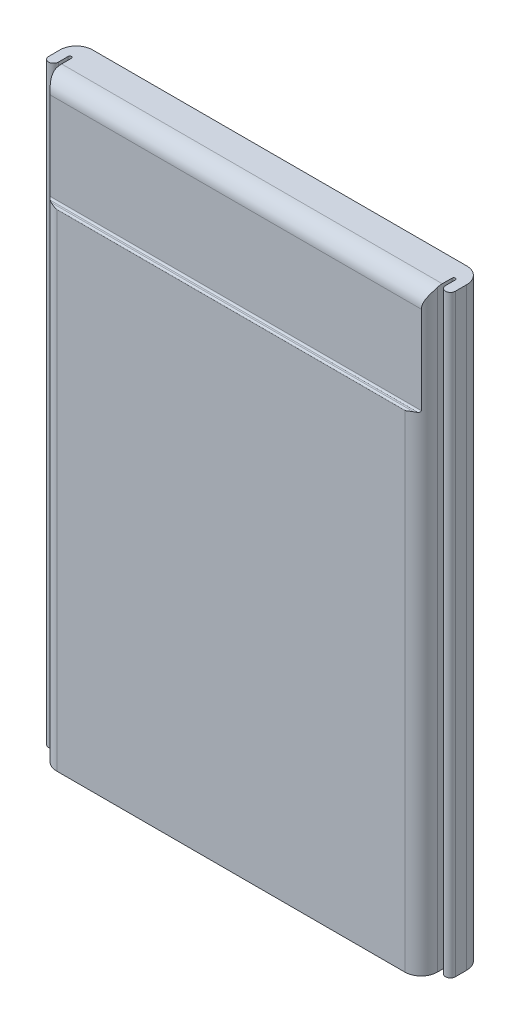
ISO-10303-21;
HEADER;
FILE_DESCRIPTION(('STEP AP214'),'2;1');
FILE_NAME('part.step','',(''),(''),'','','');
FILE_SCHEMA(('AUTOMOTIVE_DESIGN { 1 0 10303 214 1 1 1 1 }'));
ENDSEC;
DATA;
#1=APPLICATION_CONTEXT('core data for automotive mechanical design processes');
#2=APPLICATION_PROTOCOL_DEFINITION('international standard','automotive_design',2000,#1);
#3=PRODUCT_CONTEXT('',#1,'mechanical');
#4=PRODUCT('Part','Part','',(#3));
#5=PRODUCT_RELATED_PRODUCT_CATEGORY('part','',(#4));
#6=PRODUCT_DEFINITION_FORMATION('','',#4);
#7=PRODUCT_DEFINITION_CONTEXT('part definition',#1,'design');
#8=PRODUCT_DEFINITION('design','',#6,#7);
#9=PRODUCT_DEFINITION_SHAPE('','',#8);
#10=(LENGTH_UNIT() NAMED_UNIT(*) SI_UNIT(.MILLI.,.METRE.));
#11=(NAMED_UNIT(*) PLANE_ANGLE_UNIT() SI_UNIT($,.RADIAN.));
#12=(NAMED_UNIT(*) SI_UNIT($,.STERADIAN.) SOLID_ANGLE_UNIT());
#13=UNCERTAINTY_MEASURE_WITH_UNIT(LENGTH_MEASURE(1.E-05),#10,'distance_accuracy_value','');
#14=(GEOMETRIC_REPRESENTATION_CONTEXT(3) GLOBAL_UNCERTAINTY_ASSIGNED_CONTEXT((#13)) GLOBAL_UNIT_ASSIGNED_CONTEXT((#10,
#11,#12)) REPRESENTATION_CONTEXT('',''));
#15=CARTESIAN_POINT('',(0.,0.,0.));
#16=DIRECTION('',(0.,0.,1.));
#17=DIRECTION('',(1.,0.,0.));
#18=AXIS2_PLACEMENT_3D('',#15,#16,#17);
#19=CARTESIAN_POINT('',(-11.7,18.25,2.));
#20=DIRECTION('',(1.,0.,0.));
#21=DIRECTION('',(0.,0.,-1.));
#22=AXIS2_PLACEMENT_3D('',#19,#20,#21);
#23=PLANE('',#22);
#24=CARTESIAN_POINT('',(-11.7,17.25,1.7));
#25=DIRECTION('',(1.,0.,0.));
#26=DIRECTION('',(0.,0.,-1.));
#27=AXIS2_PLACEMENT_3D('',#24,#25,#26);
#28=CIRCLE('',#27,1.);
#29=CARTESIAN_POINT('',(-11.7,18.25,1.7));
#30=VERTEX_POINT('',#29);
#31=CARTESIAN_POINT('',(-11.7,18.2039392014169,2.));
#32=VERTEX_POINT('',#31);
#33=EDGE_CURVE('E354',#30,#32,#28,.T.);
#34=ORIENTED_EDGE('',*,*,#33,.F.);
#35=DIRECTION('',(0.,0.,1.));
#36=VECTOR('',#35,1.);
#37=CARTESIAN_POINT('',(-11.7,18.25,2.));
#38=LINE('',#37,#36);
#39=CARTESIAN_POINT('',(-11.7,18.25,1.1));
#40=VERTEX_POINT('',#39);
#41=EDGE_CURVE('E268',#40,#30,#38,.T.);
#42=ORIENTED_EDGE('',*,*,#41,.F.);
#43=DIRECTION('',(0.,-1.,0.));
#44=VECTOR('',#43,1.);
#45=CARTESIAN_POINT('',(-11.7,18.25,1.1));
#46=LINE('',#45,#44);
#47=CARTESIAN_POINT('',(-11.7,-18.25,1.1));
#48=VERTEX_POINT('',#47);
#49=EDGE_CURVE('E236',#40,#48,#46,.T.);
#50=ORIENTED_EDGE('',*,*,#49,.T.);
#51=DIRECTION('',(0.,0.,1.));
#52=VECTOR('',#51,1.);
#53=CARTESIAN_POINT('',(-11.7,-18.25,2.));
#54=LINE('',#53,#52);
#55=CARTESIAN_POINT('',(-11.7,-18.25,2.));
#56=VERTEX_POINT('',#55);
#57=EDGE_CURVE('E191',#48,#56,#54,.T.);
#58=ORIENTED_EDGE('',*,*,#57,.T.);
#59=DIRECTION('',(0.,-1.,0.));
#60=VECTOR('',#59,1.);
#61=CARTESIAN_POINT('',(-11.7,18.25,2.));
#62=LINE('',#61,#60);
#63=EDGE_CURVE('E234',#32,#56,#62,.T.);
#64=ORIENTED_EDGE('',*,*,#63,.F.);
#65=EDGE_LOOP('',(#34,#42,#50,#58,#64));
#66=FACE_BOUND('',#65,.T.);
#67=ADVANCED_FACE('F35',(#66),#23,.F.);
#68=CARTESIAN_POINT('',(-10.7,18.25,2.));
#69=DIRECTION('',(0.,-1.,0.));
#70=DIRECTION('',(0.,0.,-1.));
#71=AXIS2_PLACEMENT_3D('',#68,#69,#70);
#72=CYLINDRICAL_SURFACE('',#71,0.999999999999998);
#73=CARTESIAN_POINT('',(-11.1358898943541,11.75,2.9));
#74=CARTESIAN_POINT('',(-11.1214198627251,11.7499808757313,2.90701007655206));
#75=CARTESIAN_POINT('',(-11.1068006352162,11.749265460495,2.91365781850025));
#76=CARTESIAN_POINT('',(-11.0773690839468,11.7467226206552,2.9262002892041));
#77=CARTESIAN_POINT('',(-11.0625572084247,11.7448974387364,2.93209650769148));
#78=CARTESIAN_POINT('',(-11.0328483052413,11.7404225906742,2.9431131265884));
#79=CARTESIAN_POINT('',(-11.0179518829108,11.737776364859,2.9482366340857));
#80=CARTESIAN_POINT('',(-10.9880458384408,11.7318345160958,2.9577452026079));
#81=CARTESIAN_POINT('',(-10.9730361502611,11.728538480717,2.96212979134967));
#82=CARTESIAN_POINT('',(-10.9163650565092,11.7151982077031,2.97726275689995));
#83=CARTESIAN_POINT('',(-10.8744266425236,11.7035121602852,2.98558260665678));
#84=CARTESIAN_POINT('',(-10.790325698292,11.678527874136,2.99681649533091));
#85=CARTESIAN_POINT('',(-10.7481630730274,11.6652288893642,2.99972802247117));
#86=CARTESIAN_POINT('',(-10.7040200935914,11.6512712603726,2.99999392645252));
#87=CARTESIAN_POINT('',(-10.7020100056998,11.6506356140182,2.99999998538536));
#88=CARTESIAN_POINT('',(-10.7,11.65,3.));
#89=B_SPLINE_CURVE_WITH_KNOTS('',3,(#73,#74,#75,#76,#77,#78,#79,#80,#81,#82,#83,#84,#85,#86,#87,
#88),.UNSPECIFIED.,.F.,.F.,(4,2,2,2,2,2,2,4),(0.,0.0481832877468274,0.0962695258809056,
0.144156934372804,0.192074835171756,0.324576413514658,0.457139513943925,0.463464095400245),.UNSPECIFIED.);
#90=CARTESIAN_POINT('',(-11.1358898943541,11.75,2.9));
#91=VERTEX_POINT('',#90);
#92=CARTESIAN_POINT('',(-10.7,11.65,3.));
#93=VERTEX_POINT('',#92);
#94=EDGE_CURVE('E446',#91,#93,#89,.T.);
#95=ORIENTED_EDGE('',*,*,#94,.F.);
#96=CARTESIAN_POINT('',(-10.7,11.75,2.));
#97=DIRECTION('',(0.,-1.,0.));
#98=DIRECTION('',(0.,0.,-1.));
#99=AXIS2_PLACEMENT_3D('',#96,#97,#98);
#100=CIRCLE('',#99,0.999999999999998);
#101=CARTESIAN_POINT('',(-11.3,11.75,2.8));
#102=VERTEX_POINT('',#101);
#103=EDGE_CURVE('E439',#102,#91,#100,.F.);
#104=ORIENTED_EDGE('',*,*,#103,.F.);
#105=CARTESIAN_POINT('',(-11.4141428428543,11.85,2.7));
#106=CARTESIAN_POINT('',(-11.4141489293291,11.8455408204478,2.69999248786504));
#107=CARTESIAN_POINT('',(-11.4138510092808,11.8410910597886,2.70029775881517));
#108=CARTESIAN_POINT('',(-11.4126994691109,11.8323738560573,2.701470314203));
#109=CARTESIAN_POINT('',(-11.4118501324565,11.8281052756264,2.70233326627442));
#110=CARTESIAN_POINT('',(-11.4096490906761,11.8198505675885,2.70455690691447));
#111=CARTESIAN_POINT('',(-11.4082984930557,11.8158638401912,2.70591649808541));
#112=CARTESIAN_POINT('',(-11.4051647999995,11.8082318158491,2.70904693614613));
#113=CARTESIAN_POINT('',(-11.4033808615795,11.8045872038219,2.71081858432721));
#114=CARTESIAN_POINT('',(-11.3987366355269,11.7964269403725,2.71538878436792));
#115=CARTESIAN_POINT('',(-11.3957209891506,11.7920776684878,2.71832631291176));
#116=CARTESIAN_POINT('',(-11.3891838809144,11.7841156602975,2.7246007473437));
#117=CARTESIAN_POINT('',(-11.3856617231006,11.7805039542184,2.72793820166588));
#118=CARTESIAN_POINT('',(-11.3766909791274,11.7726177819811,2.73630199852206));
#119=CARTESIAN_POINT('',(-11.3710511878412,11.7686941692869,2.74145263873207));
#120=CARTESIAN_POINT('',(-11.3592500977088,11.7620711956624,2.75196575389125));
#121=CARTESIAN_POINT('',(-11.3530867312016,11.7593769843702,2.75732901943857));
#122=CARTESIAN_POINT('',(-11.3392742272828,11.7546666521782,2.7690409236125));
#123=CARTESIAN_POINT('',(-11.3315578447015,11.7528610001037,2.77539251526355));
#124=CARTESIAN_POINT('',(-11.3159147987456,11.7505406684631,2.78787712135895));
#125=CARTESIAN_POINT('',(-11.307991918287,11.7500102927386,2.79401186785645));
#126=CARTESIAN_POINT('',(-11.3000000000031,11.7499999999851,2.79999999999768));
#127=B_SPLINE_CURVE_WITH_KNOTS('',3,(#105,#106,#107,#108,#109,#110,#111,#112,#113,#114,#115,
#116,#117,#118,#119,#120,#121,#122,#123,#124,#125,#126),.UNSPECIFIED.,.F.,.F.,(4,2,2,2,2,2,2,2,
2,2,4),(0.,0.0133422524322359,0.0265820811673228,0.0397928297781969,0.0530294862024046,
0.0710883037595173,0.0891721757659267,0.114790772465901,0.140515715263553,0.170888612979083,
0.200885721822077),.UNSPECIFIED.);
#128=CARTESIAN_POINT('',(-11.4141428428543,11.85,2.7));
#129=VERTEX_POINT('',#128);
#130=EDGE_CURVE('E445',#129,#102,#127,.T.);
#131=ORIENTED_EDGE('',*,*,#130,.F.);
#132=DIRECTION('',(0.,-1.,0.));
#133=VECTOR('',#132,1.);
#134=CARTESIAN_POINT('',(-11.4141428428543,18.25,2.7));
#135=LINE('',#134,#133);
#136=CARTESIAN_POINT('',(-11.4141428428543,17.25,2.7));
#137=VERTEX_POINT('',#136);
#138=EDGE_CURVE('E466',#137,#129,#135,.T.);
#139=ORIENTED_EDGE('',*,*,#138,.F.);
#140=CARTESIAN_POINT('',(-11.7,18.2039392014169,2.));
#141=CARTESIAN_POINT('',(-11.7000031207841,18.1964536809527,2.02381416730361));
#142=CARTESIAN_POINT('',(-11.6991490543043,18.1880761226066,2.04732401697071));
#143=CARTESIAN_POINT('',(-11.695884721432,18.1696464909386,2.09353136410262));
#144=CARTESIAN_POINT('',(-11.6934765663476,18.1595967031518,2.11622991966311));
#145=CARTESIAN_POINT('',(-11.6842162088114,18.1272864065625,2.18245346211998));
#146=CARTESIAN_POINT('',(-11.6753216096477,18.1027105982703,2.22459058407956));
#147=CARTESIAN_POINT('',(-11.6535866732435,18.0484969944097,2.30390995109177));
#148=CARTESIAN_POINT('',(-11.6407662679136,18.0188850979876,2.34111589558791));
#149=CARTESIAN_POINT('',(-11.6125978396025,17.9552002532373,2.41057652314388));
#150=CARTESIAN_POINT('',(-11.5972423800399,17.9211142422482,2.44281608277366));
#151=CARTESIAN_POINT('',(-11.5631453001713,17.8437569751299,2.50642552762656));
#152=CARTESIAN_POINT('',(-11.5442388876336,17.7998729332956,2.53696040381006));
#153=CARTESIAN_POINT('',(-11.5074554768263,17.7074744239607,2.59082757613575));
#154=CARTESIAN_POINT('',(-11.4895781328426,17.6589615262456,2.61416230278105));
#155=CARTESIAN_POINT('',(-11.4608454828896,17.5675421180144,2.64924963242335));
#156=CARTESIAN_POINT('',(-11.449300684578,17.5253825349463,2.66237259843258));
#157=CARTESIAN_POINT('',(-11.4305516445324,17.4388498001019,2.6830035726455));
#158=CARTESIAN_POINT('',(-11.4233313881364,17.3944854825908,2.69053232262124));
#159=CARTESIAN_POINT('',(-11.4173845170366,17.3330985372838,2.69668016076469));
#160=CARTESIAN_POINT('',(-11.4161743693266,17.3165388836832,2.69792250734469));
#161=CARTESIAN_POINT('',(-11.4145522622472,17.2833221705958,2.69958287914671));
#162=CARTESIAN_POINT('',(-11.4141411382644,17.2666650274066,2.70000004163951));
#163=CARTESIAN_POINT('',(-11.4141428428543,17.25,2.7));
#164=B_SPLINE_CURVE_WITH_KNOTS('',3,(#140,#141,#142,#143,#144,#145,#146,#147,#148,#149,#150,
#151,#152,#153,#154,#155,#156,#157,#158,#159,#160,#161,#162,#163),.UNSPECIFIED.,.F.,.F.,(4,2,2,
2,2,2,2,2,2,2,2,4),(0.,0.0748174640596613,0.149533498174083,0.297465166621173,0.444657878679362,
0.592290313818853,0.761774077816246,0.931200567641226,1.06764661117946,1.20358419180517,
1.253501732853,1.3034714351196),.UNSPECIFIED.);
#165=EDGE_CURVE('E468',#32,#137,#164,.T.);
#166=ORIENTED_EDGE('',*,*,#165,.F.);
#167=ORIENTED_EDGE('',*,*,#63,.T.);
#168=CARTESIAN_POINT('',(-10.7,-18.25,2.));
#169=DIRECTION('',(0.,1.,0.));
#170=DIRECTION('',(0.,0.,1.));
#171=AXIS2_PLACEMENT_3D('',#168,#169,#170);
#172=CIRCLE('',#171,0.999999999999998);
#173=CARTESIAN_POINT('',(-10.7,-18.25,3.));
#174=VERTEX_POINT('',#173);
#175=EDGE_CURVE('E194',#56,#174,#172,.T.);
#176=ORIENTED_EDGE('',*,*,#175,.T.);
#177=DIRECTION('',(0.,-1.,0.));
#178=VECTOR('',#177,1.);
#179=CARTESIAN_POINT('',(-10.7,18.25,3.));
#180=LINE('',#179,#178);
#181=EDGE_CURVE('E232',#93,#174,#180,.T.);
#182=ORIENTED_EDGE('',*,*,#181,.F.);
#183=EDGE_LOOP('',(#95,#104,#131,#139,#166,#167,#176,#182));
#184=FACE_BOUND('',#183,.T.);
#185=ADVANCED_FACE('F372',(#184),#72,.T.);
#186=CARTESIAN_POINT('',(10.7,18.25,2.));
#187=DIRECTION('',(0.,-1.,0.));
#188=DIRECTION('',(0.,0.,-1.));
#189=AXIS2_PLACEMENT_3D('',#186,#187,#188);
#190=CYLINDRICAL_SURFACE('',#189,1.);
#191=CARTESIAN_POINT('',(11.1358898943541,11.75,2.9));
#192=CARTESIAN_POINT('',(11.1214198627251,11.7499808757313,2.90701007655207));
#193=CARTESIAN_POINT('',(11.1068006352162,11.749265460495,2.91365781850025));
#194=CARTESIAN_POINT('',(11.0773690839467,11.7467226206552,2.92620028920411));
#195=CARTESIAN_POINT('',(11.0625572084247,11.7448974387364,2.93209650769149));
#196=CARTESIAN_POINT('',(11.0328483052413,11.7404225906742,2.94311312658841));
#197=CARTESIAN_POINT('',(11.0179518829108,11.737776364859,2.94823663408571));
#198=CARTESIAN_POINT('',(10.9880458384408,11.7318345160958,2.9577452026079));
#199=CARTESIAN_POINT('',(10.9730361502611,11.728538480717,2.96212979134967));
#200=CARTESIAN_POINT('',(10.9163650565092,11.7151982077031,2.97726275689995));
#201=CARTESIAN_POINT('',(10.8744266425236,11.7035121602853,2.98558260665678));
#202=CARTESIAN_POINT('',(10.790325698292,11.6785278741359,2.99681649533091));
#203=CARTESIAN_POINT('',(10.7481630730275,11.6652288893638,2.99972802247117));
#204=CARTESIAN_POINT('',(10.7040200935914,11.6512712603726,2.99999392645252));
#205=CARTESIAN_POINT('',(10.7020100056998,11.6506356140182,2.99999998538536));
#206=CARTESIAN_POINT('',(10.7,11.65,3.));
#207=B_SPLINE_CURVE_WITH_KNOTS('',3,(#191,#192,#193,#194,#195,#196,#197,#198,#199,#200,#201,
#202,#203,#204,#205,#206),.UNSPECIFIED.,.F.,.F.,(4,2,2,2,2,2,2,4),(0.,0.0481832877468428,
0.0962695258809339,0.144156934372815,0.192074835171754,0.324576413514649,0.457139513943923,
0.463464095400246),.UNSPECIFIED.);
#208=CARTESIAN_POINT('',(11.1358898943541,11.75,2.9));
#209=VERTEX_POINT('',#208);
#210=CARTESIAN_POINT('',(10.7,11.65,3.));
#211=VERTEX_POINT('',#210);
#212=EDGE_CURVE('E326',#209,#211,#207,.T.);
#213=ORIENTED_EDGE('',*,*,#212,.T.);
#214=DIRECTION('',(0.,-1.,0.));
#215=VECTOR('',#214,1.);
#216=CARTESIAN_POINT('',(10.7,18.25,3.));
#217=LINE('',#216,#215);
#218=CARTESIAN_POINT('',(10.7,-18.25,3.));
#219=VERTEX_POINT('',#218);
#220=EDGE_CURVE('E230',#211,#219,#217,.T.);
#221=ORIENTED_EDGE('',*,*,#220,.T.);
#222=CARTESIAN_POINT('',(10.7,-18.25,2.));
#223=DIRECTION('',(0.,1.,0.));
#224=DIRECTION('',(0.,0.,-1.));
#225=AXIS2_PLACEMENT_3D('',#222,#223,#224);
#226=CIRCLE('',#225,1.);
#227=CARTESIAN_POINT('',(11.7,-18.25,2.));
#228=VERTEX_POINT('',#227);
#229=EDGE_CURVE('E200',#219,#228,#226,.T.);
#230=ORIENTED_EDGE('',*,*,#229,.T.);
#231=DIRECTION('',(0.,-1.,0.));
#232=VECTOR('',#231,1.);
#233=CARTESIAN_POINT('',(11.7,18.25,2.));
#234=LINE('',#233,#232);
#235=CARTESIAN_POINT('',(11.7,18.2039392014169,2.));
#236=VERTEX_POINT('',#235);
#237=EDGE_CURVE('E228',#236,#228,#234,.T.);
#238=ORIENTED_EDGE('',*,*,#237,.F.);
#239=CARTESIAN_POINT('',(11.7,18.2039392014169,2.));
#240=CARTESIAN_POINT('',(11.7000031207841,18.1964536809527,2.02381416730361));
#241=CARTESIAN_POINT('',(11.6991490543043,18.1880761226066,2.04732401697071));
#242=CARTESIAN_POINT('',(11.695884721432,18.1696464909386,2.09353136410262));
#243=CARTESIAN_POINT('',(11.6934765663476,18.1595967031518,2.11622991966311));
#244=CARTESIAN_POINT('',(11.6842162088114,18.1272864065625,2.18245346211998));
#245=CARTESIAN_POINT('',(11.6753216096476,18.1027105982703,2.22459058407956));
#246=CARTESIAN_POINT('',(11.6535866732435,18.0484969944097,2.30390995109177));
#247=CARTESIAN_POINT('',(11.6407662679136,18.0188850979876,2.34111589558791));
#248=CARTESIAN_POINT('',(11.6125978396025,17.9552002532373,2.41057652314389));
#249=CARTESIAN_POINT('',(11.5972423800399,17.9211142422482,2.44281608277366));
#250=CARTESIAN_POINT('',(11.5631453001713,17.8437569751299,2.50642552762656));
#251=CARTESIAN_POINT('',(11.5442388876336,17.7998729332956,2.53696040381006));
#252=CARTESIAN_POINT('',(11.5074554768263,17.7074744239607,2.59082757613576));
#253=CARTESIAN_POINT('',(11.4895781328426,17.6589615262456,2.61416230278106));
#254=CARTESIAN_POINT('',(11.4608454828896,17.5675421180144,2.64924963242336));
#255=CARTESIAN_POINT('',(11.449300684578,17.5253825349463,2.66237259843259));
#256=CARTESIAN_POINT('',(11.4305516445324,17.4388498001019,2.6830035726455));
#257=CARTESIAN_POINT('',(11.4233313881364,17.3944854825908,2.69053232262124));
#258=CARTESIAN_POINT('',(11.4173845170366,17.3330985372838,2.69668016076469));
#259=CARTESIAN_POINT('',(11.4161743693266,17.3165388836832,2.69792250734469));
#260=CARTESIAN_POINT('',(11.4145522622472,17.2833221705958,2.69958287914671));
#261=CARTESIAN_POINT('',(11.4141411382644,17.2666650274066,2.70000004163951));
#262=CARTESIAN_POINT('',(11.4141428428543,17.25,2.7));
#263=B_SPLINE_CURVE_WITH_KNOTS('',3,(#239,#240,#241,#242,#243,#244,#245,#246,#247,#248,#249,
#250,#251,#252,#253,#254,#255,#256,#257,#258,#259,#260,#261,#262),.UNSPECIFIED.,.F.,.F.,(4,2,2,
2,2,2,2,2,2,2,2,4),(0.,0.0748174640596621,0.149533498174084,0.297465166621177,0.444657878679368,
0.592290313818854,0.76177407781625,0.93120056764123,1.06764661117947,1.20358419180517,
1.253501732853,1.3034714351196),.UNSPECIFIED.);
#264=CARTESIAN_POINT('',(11.4141428428543,17.25,2.7));
#265=VERTEX_POINT('',#264);
#266=EDGE_CURVE('E317',#236,#265,#263,.T.);
#267=ORIENTED_EDGE('',*,*,#266,.T.);
#268=DIRECTION('',(0.,-1.,0.));
#269=VECTOR('',#268,1.);
#270=CARTESIAN_POINT('',(11.4141428428543,18.25,2.7));
#271=LINE('',#270,#269);
#272=CARTESIAN_POINT('',(11.4141428428543,11.85,2.7));
#273=VERTEX_POINT('',#272);
#274=EDGE_CURVE('E183',#265,#273,#271,.T.);
#275=ORIENTED_EDGE('',*,*,#274,.T.);
#276=CARTESIAN_POINT('',(11.4141428428543,11.85,2.7));
#277=CARTESIAN_POINT('',(11.4141489293291,11.8455408204478,2.69999248786504));
#278=CARTESIAN_POINT('',(11.4138510092808,11.8410910597886,2.70029775881517));
#279=CARTESIAN_POINT('',(11.4126994691109,11.8323738560573,2.701470314203));
#280=CARTESIAN_POINT('',(11.4118501324565,11.8281052756264,2.70233326627442));
#281=CARTESIAN_POINT('',(11.409649090676,11.8198505675885,2.70455690691447));
#282=CARTESIAN_POINT('',(11.4082984930557,11.8158638401912,2.70591649808541));
#283=CARTESIAN_POINT('',(11.4051647999995,11.8082318158491,2.70904693614613));
#284=CARTESIAN_POINT('',(11.4033808615794,11.8045872038219,2.71081858432721));
#285=CARTESIAN_POINT('',(11.3987366355269,11.7964269403725,2.71538878436792));
#286=CARTESIAN_POINT('',(11.3957209891506,11.7920776684878,2.71832631291176));
#287=CARTESIAN_POINT('',(11.3891838809144,11.7841156602975,2.7246007473437));
#288=CARTESIAN_POINT('',(11.3856617231006,11.7805039542184,2.72793820166587));
#289=CARTESIAN_POINT('',(11.3766909791274,11.7726177819811,2.73630199852206));
#290=CARTESIAN_POINT('',(11.3710511878412,11.7686941692869,2.74145263873207));
#291=CARTESIAN_POINT('',(11.3592500977088,11.7620711956624,2.75196575389125));
#292=CARTESIAN_POINT('',(11.3530867312016,11.7593769843702,2.75732901943856));
#293=CARTESIAN_POINT('',(11.3392742272828,11.7546666521782,2.7690409236125));
#294=CARTESIAN_POINT('',(11.3315578447015,11.7528610001037,2.77539251526355));
#295=CARTESIAN_POINT('',(11.3159147987456,11.7505406684631,2.78787712135895));
#296=CARTESIAN_POINT('',(11.307991918287,11.7500102927386,2.79401186785645));
#297=CARTESIAN_POINT('',(11.3000000000031,11.7499999999851,2.79999999999768));
#298=B_SPLINE_CURVE_WITH_KNOTS('',3,(#276,#277,#278,#279,#280,#281,#282,#283,#284,#285,#286,
#287,#288,#289,#290,#291,#292,#293,#294,#295,#296,#297),.UNSPECIFIED.,.F.,.F.,(4,2,2,2,2,2,2,2,
2,2,4),(0.,0.0133422524322359,0.0265820811673228,0.0397928297781969,0.0530294862024046,
0.0710883037595143,0.0891721757659253,0.114790772465901,0.140515715263553,0.170888612979085,
0.200885721822075),.UNSPECIFIED.);
#299=CARTESIAN_POINT('',(11.3,11.75,2.8));
#300=VERTEX_POINT('',#299);
#301=EDGE_CURVE('E346',#273,#300,#298,.T.);
#302=ORIENTED_EDGE('',*,*,#301,.T.);
#303=CARTESIAN_POINT('',(10.7,11.75,2.));
#304=DIRECTION('',(0.,1.,0.));
#305=DIRECTION('',(0.,0.,1.));
#306=AXIS2_PLACEMENT_3D('',#303,#304,#305);
#307=CIRCLE('',#306,1.);
#308=EDGE_CURVE('E353',#300,#209,#307,.F.);
#309=ORIENTED_EDGE('',*,*,#308,.T.);
#310=EDGE_LOOP('',(#213,#221,#230,#238,#267,#275,#302,#309));
#311=FACE_BOUND('',#310,.T.);
#312=ADVANCED_FACE('F378',(#311),#190,.T.);
#313=CARTESIAN_POINT('',(11.7,18.25,1.1));
#314=DIRECTION('',(-1.,0.,0.));
#315=DIRECTION('',(0.,0.,1.));
#316=AXIS2_PLACEMENT_3D('',#313,#314,#315);
#317=PLANE('',#316);
#318=CARTESIAN_POINT('',(11.7,17.25,1.7));
#319=DIRECTION('',(-1.,0.,0.));
#320=DIRECTION('',(0.,0.,1.));
#321=AXIS2_PLACEMENT_3D('',#318,#319,#320);
#322=CIRCLE('',#321,1.);
#323=CARTESIAN_POINT('',(11.7,18.25,1.7));
#324=VERTEX_POINT('',#323);
#325=EDGE_CURVE('E50',#324,#236,#322,.F.);
#326=ORIENTED_EDGE('',*,*,#325,.T.);
#327=ORIENTED_EDGE('',*,*,#237,.T.);
#328=DIRECTION('',(0.,0.,-1.));
#329=VECTOR('',#328,1.);
#330=CARTESIAN_POINT('',(11.7,-18.25,1.1));
#331=LINE('',#330,#329);
#332=CARTESIAN_POINT('',(11.7,-18.25,1.1));
#333=VERTEX_POINT('',#332);
#334=EDGE_CURVE('E203',#228,#333,#331,.T.);
#335=ORIENTED_EDGE('',*,*,#334,.T.);
#336=DIRECTION('',(0.,-1.,0.));
#337=VECTOR('',#336,1.);
#338=CARTESIAN_POINT('',(11.7,18.25,1.1));
#339=LINE('',#338,#337);
#340=CARTESIAN_POINT('',(11.7,18.25,1.1));
#341=VERTEX_POINT('',#340);
#342=EDGE_CURVE('E225',#341,#333,#339,.T.);
#343=ORIENTED_EDGE('',*,*,#342,.F.);
#344=DIRECTION('',(0.,0.,-1.));
#345=VECTOR('',#344,1.);
#346=CARTESIAN_POINT('',(11.7,18.25,1.1));
#347=LINE('',#346,#345);
#348=EDGE_CURVE('E271',#324,#341,#347,.T.);
#349=ORIENTED_EDGE('',*,*,#348,.F.);
#350=EDGE_LOOP('',(#326,#327,#335,#343,#349));
#351=FACE_BOUND('',#350,.T.);
#352=ADVANCED_FACE('F395',(#351),#317,.F.);
#353=CARTESIAN_POINT('',(-11.5,18.25,0.999999999999997));
#354=DIRECTION('',(0.,-1.,0.));
#355=DIRECTION('',(0.,0.,-1.));
#356=AXIS2_PLACEMENT_3D('',#353,#354,#355);
#357=CYLINDRICAL_SURFACE('',#356,0.999999999999997);
#358=CARTESIAN_POINT('',(-11.5,-18.25,0.999999999999997));
#359=DIRECTION('',(0.,1.,0.));
#360=DIRECTION('',(0.,0.,1.));
#361=AXIS2_PLACEMENT_3D('',#358,#359,#360);
#362=CIRCLE('',#361,0.999999999999997);
#363=CARTESIAN_POINT('',(-11.5,-18.25,0.));
#364=VERTEX_POINT('',#363);
#365=CARTESIAN_POINT('',(-12.5,-18.25,1.));
#366=VERTEX_POINT('',#365);
#367=EDGE_CURVE('E179',#364,#366,#362,.T.);
#368=ORIENTED_EDGE('',*,*,#367,.T.);
#369=DIRECTION('',(0.,-1.,0.));
#370=VECTOR('',#369,1.);
#371=CARTESIAN_POINT('',(-12.5,18.25,1.));
#372=LINE('',#371,#370);
#373=CARTESIAN_POINT('',(-12.5,18.25,1.));
#374=VERTEX_POINT('',#373);
#375=EDGE_CURVE('E11',#374,#366,#372,.T.);
#376=ORIENTED_EDGE('',*,*,#375,.F.);
#377=CARTESIAN_POINT('',(-11.5,18.25,0.999999999999997));
#378=DIRECTION('',(0.,1.,0.));
#379=DIRECTION('',(0.,0.,1.));
#380=AXIS2_PLACEMENT_3D('',#377,#378,#379);
#381=CIRCLE('',#380,0.999999999999997);
#382=CARTESIAN_POINT('',(-11.5,18.25,0.));
#383=VERTEX_POINT('',#382);
#384=EDGE_CURVE('E215',#383,#374,#381,.T.);
#385=ORIENTED_EDGE('',*,*,#384,.F.);
#386=DIRECTION('',(0.,-1.,0.));
#387=VECTOR('',#386,1.);
#388=CARTESIAN_POINT('',(-11.5,18.25,0.));
#389=LINE('',#388,#387);
#390=EDGE_CURVE('E175',#383,#364,#389,.T.);
#391=ORIENTED_EDGE('',*,*,#390,.T.);
#392=EDGE_LOOP('',(#368,#376,#385,#391));
#393=FACE_BOUND('',#392,.T.);
#394=ADVANCED_FACE('F37',(#393),#357,.T.);
#395=CARTESIAN_POINT('',(-12.5,18.25,1.));
#396=DIRECTION('',(1.,0.,0.));
#397=DIRECTION('',(0.,0.,-1.));
#398=AXIS2_PLACEMENT_3D('',#395,#396,#397);
#399=PLANE('',#398);
#400=DIRECTION('',(0.,0.,1.));
#401=VECTOR('',#400,1.);
#402=CARTESIAN_POINT('',(-12.5,-18.25,1.));
#403=LINE('',#402,#401);
#404=CARTESIAN_POINT('',(-12.5,-18.25,1.7));
#405=VERTEX_POINT('',#404);
#406=EDGE_CURVE('E182',#366,#405,#403,.T.);
#407=ORIENTED_EDGE('',*,*,#406,.T.);
#408=DIRECTION('',(0.,-1.,0.));
#409=VECTOR('',#408,1.);
#410=CARTESIAN_POINT('',(-12.5,18.25,1.7));
#411=LINE('',#410,#409);
#412=CARTESIAN_POINT('',(-12.5,18.25,1.7));
#413=VERTEX_POINT('',#412);
#414=EDGE_CURVE('E43',#413,#405,#411,.T.);
#415=ORIENTED_EDGE('',*,*,#414,.F.);
#416=DIRECTION('',(0.,0.,1.));
#417=VECTOR('',#416,1.);
#418=CARTESIAN_POINT('',(-12.5,18.25,1.));
#419=LINE('',#418,#417);
#420=EDGE_CURVE('E124',#374,#413,#419,.T.);
#421=ORIENTED_EDGE('',*,*,#420,.F.);
#422=ORIENTED_EDGE('',*,*,#375,.T.);
#423=EDGE_LOOP('',(#407,#415,#421,#422));
#424=FACE_BOUND('',#423,.T.);
#425=ADVANCED_FACE('F390',(#424),#399,.F.);
#426=CARTESIAN_POINT('',(-12.2,18.25,1.7));
#427=DIRECTION('',(0.,-1.,0.));
#428=DIRECTION('',(0.,0.,-1.));
#429=AXIS2_PLACEMENT_3D('',#426,#427,#428);
#430=CYLINDRICAL_SURFACE('',#429,0.299999999999998);
#431=CARTESIAN_POINT('',(-12.2,-18.25,1.7));
#432=DIRECTION('',(0.,1.,0.));
#433=DIRECTION('',(0.,0.,1.));
#434=AXIS2_PLACEMENT_3D('',#431,#432,#433);
#435=CIRCLE('',#434,0.299999999999998);
#436=CARTESIAN_POINT('',(-11.9,-18.25,1.7));
#437=VERTEX_POINT('',#436);
#438=EDGE_CURVE('E185',#405,#437,#435,.T.);
#439=ORIENTED_EDGE('',*,*,#438,.T.);
#440=DIRECTION('',(0.,-1.,0.));
#441=VECTOR('',#440,1.);
#442=CARTESIAN_POINT('',(-11.9,18.25,1.7));
#443=LINE('',#442,#441);
#444=CARTESIAN_POINT('',(-11.9,18.25,1.7));
#445=VERTEX_POINT('',#444);
#446=EDGE_CURVE('E242',#445,#437,#443,.T.);
#447=ORIENTED_EDGE('',*,*,#446,.F.);
#448=CARTESIAN_POINT('',(-12.2,18.25,1.7));
#449=DIRECTION('',(0.,1.,0.));
#450=DIRECTION('',(0.,0.,1.));
#451=AXIS2_PLACEMENT_3D('',#448,#449,#450);
#452=CIRCLE('',#451,0.299999999999998);
#453=EDGE_CURVE('E250',#413,#445,#452,.T.);
#454=ORIENTED_EDGE('',*,*,#453,.F.);
#455=ORIENTED_EDGE('',*,*,#414,.T.);
#456=EDGE_LOOP('',(#439,#447,#454,#455));
#457=FACE_BOUND('',#456,.T.);
#458=ADVANCED_FACE('F248',(#457),#430,.T.);
#459=CARTESIAN_POINT('',(-11.9,18.25,1.7));
#460=DIRECTION('',(-1.,0.,0.));
#461=DIRECTION('',(0.,0.,1.));
#462=AXIS2_PLACEMENT_3D('',#459,#460,#461);
#463=PLANE('',#462);
#464=DIRECTION('',(0.,0.,-1.));
#465=VECTOR('',#464,1.);
#466=CARTESIAN_POINT('',(-11.9,-18.25,1.7));
#467=LINE('',#466,#465);
#468=CARTESIAN_POINT('',(-11.9,-18.25,1.1));
#469=VERTEX_POINT('',#468);
#470=EDGE_CURVE('E187',#437,#469,#467,.T.);
#471=ORIENTED_EDGE('',*,*,#470,.T.);
#472=DIRECTION('',(0.,-1.,0.));
#473=VECTOR('',#472,1.);
#474=CARTESIAN_POINT('',(-11.9,18.25,1.1));
#475=LINE('',#474,#473);
#476=CARTESIAN_POINT('',(-11.9,18.25,1.1));
#477=VERTEX_POINT('',#476);
#478=EDGE_CURVE('E239',#477,#469,#475,.T.);
#479=ORIENTED_EDGE('',*,*,#478,.F.);
#480=DIRECTION('',(0.,0.,-1.));
#481=VECTOR('',#480,1.);
#482=CARTESIAN_POINT('',(-11.9,18.25,1.7));
#483=LINE('',#482,#481);
#484=EDGE_CURVE('E269',#445,#477,#483,.T.);
#485=ORIENTED_EDGE('',*,*,#484,.F.);
#486=ORIENTED_EDGE('',*,*,#446,.T.);
#487=EDGE_LOOP('',(#471,#479,#485,#486));
#488=FACE_BOUND('',#487,.T.);
#489=ADVANCED_FACE('F259',(#488),#463,.F.);
#490=CARTESIAN_POINT('',(-11.8,18.25,1.1));
#491=DIRECTION('',(0.,-1.,0.));
#492=DIRECTION('',(0.,0.,-1.));
#493=AXIS2_PLACEMENT_3D('',#490,#491,#492);
#494=CYLINDRICAL_SURFACE('',#493,0.100000000000001);
#495=CARTESIAN_POINT('',(-11.8,-18.25,1.1));
#496=DIRECTION('',(0.,-1.,0.));
#497=DIRECTION('',(0.,0.,1.));
#498=AXIS2_PLACEMENT_3D('',#495,#496,#497);
#499=CIRCLE('',#498,0.100000000000001);
#500=EDGE_CURVE('E189',#469,#48,#499,.T.);
#501=ORIENTED_EDGE('',*,*,#500,.T.);
#502=ORIENTED_EDGE('',*,*,#49,.F.);
#503=CARTESIAN_POINT('',(-11.8,18.25,1.1));
#504=DIRECTION('',(0.,-1.,0.));
#505=DIRECTION('',(0.,0.,1.));
#506=AXIS2_PLACEMENT_3D('',#503,#504,#505);
#507=CIRCLE('',#506,0.100000000000001);
#508=EDGE_CURVE('E265',#477,#40,#507,.T.);
#509=ORIENTED_EDGE('',*,*,#508,.F.);
#510=ORIENTED_EDGE('',*,*,#478,.T.);
#511=EDGE_LOOP('',(#501,#502,#509,#510));
#512=FACE_BOUND('',#511,.T.);
#513=ADVANCED_FACE('F263',(#512),#494,.F.);
#514=CARTESIAN_POINT('',(-10.7,18.25,3.));
#515=DIRECTION('',(0.,0.,-1.));
#516=DIRECTION('',(-1.,0.,0.));
#517=AXIS2_PLACEMENT_3D('',#514,#515,#516);
#518=PLANE('',#517);
#519=ORIENTED_EDGE('',*,*,#220,.F.);
#520=DIRECTION('',(-1.,0.,0.));
#521=VECTOR('',#520,1.);
#522=CARTESIAN_POINT('',(12.501,11.65,3.));
#523=LINE('',#522,#521);
#524=EDGE_CURVE('E301',#211,#93,#523,.T.);
#525=ORIENTED_EDGE('',*,*,#524,.T.);
#526=ORIENTED_EDGE('',*,*,#181,.T.);
#527=DIRECTION('',(1.,0.,0.));
#528=VECTOR('',#527,1.);
#529=CARTESIAN_POINT('',(-10.7,-18.25,3.));
#530=LINE('',#529,#528);
#531=EDGE_CURVE('E197',#174,#219,#530,.T.);
#532=ORIENTED_EDGE('',*,*,#531,.T.);
#533=EDGE_LOOP('',(#519,#525,#526,#532));
#534=FACE_BOUND('',#533,.T.);
#535=ADVANCED_FACE('F386',(#534),#518,.F.);
#536=CARTESIAN_POINT('',(11.8,18.25,1.1));
#537=DIRECTION('',(0.,-1.,0.));
#538=DIRECTION('',(0.,0.,-1.));
#539=AXIS2_PLACEMENT_3D('',#536,#537,#538);
#540=CYLINDRICAL_SURFACE('',#539,0.0999999999999977);
#541=CARTESIAN_POINT('',(11.8,-18.25,1.1));
#542=DIRECTION('',(0.,-1.,0.));
#543=DIRECTION('',(0.,0.,-1.));
#544=AXIS2_PLACEMENT_3D('',#541,#542,#543);
#545=CIRCLE('',#544,0.0999999999999977);
#546=CARTESIAN_POINT('',(11.9,-18.25,1.1));
#547=VERTEX_POINT('',#546);
#548=EDGE_CURVE('E205',#333,#547,#545,.T.);
#549=ORIENTED_EDGE('',*,*,#548,.T.);
#550=DIRECTION('',(0.,-1.,0.));
#551=VECTOR('',#550,1.);
#552=CARTESIAN_POINT('',(11.9,18.25,1.1));
#553=LINE('',#552,#551);
#554=CARTESIAN_POINT('',(11.9,18.25,1.1));
#555=VERTEX_POINT('',#554);
#556=EDGE_CURVE('E222',#555,#547,#553,.T.);
#557=ORIENTED_EDGE('',*,*,#556,.F.);
#558=CARTESIAN_POINT('',(11.8,18.25,1.1));
#559=DIRECTION('',(0.,-1.,0.));
#560=DIRECTION('',(0.,0.,-1.));
#561=AXIS2_PLACEMENT_3D('',#558,#559,#560);
#562=CIRCLE('',#561,0.0999999999999977);
#563=EDGE_CURVE('E277',#341,#555,#562,.T.);
#564=ORIENTED_EDGE('',*,*,#563,.F.);
#565=ORIENTED_EDGE('',*,*,#342,.T.);
#566=EDGE_LOOP('',(#549,#557,#564,#565));
#567=FACE_BOUND('',#566,.T.);
#568=ADVANCED_FACE('F407',(#567),#540,.F.);
#569=CARTESIAN_POINT('',(11.9,18.25,1.70000000000001));
#570=DIRECTION('',(1.,0.,0.));
#571=DIRECTION('',(0.,0.,-1.));
#572=AXIS2_PLACEMENT_3D('',#569,#570,#571);
#573=PLANE('',#572);
#574=DIRECTION('',(0.,0.,1.));
#575=VECTOR('',#574,1.);
#576=CARTESIAN_POINT('',(11.9,-18.25,1.70000000000001));
#577=LINE('',#576,#575);
#578=CARTESIAN_POINT('',(11.9,-18.25,1.70000000000001));
#579=VERTEX_POINT('',#578);
#580=EDGE_CURVE('E207',#547,#579,#577,.T.);
#581=ORIENTED_EDGE('',*,*,#580,.T.);
#582=DIRECTION('',(0.,-1.,0.));
#583=VECTOR('',#582,1.);
#584=CARTESIAN_POINT('',(11.9,18.25,1.70000000000001));
#585=LINE('',#584,#583);
#586=CARTESIAN_POINT('',(11.9,18.25,1.70000000000001));
#587=VERTEX_POINT('',#586);
#588=EDGE_CURVE('E219',#587,#579,#585,.T.);
#589=ORIENTED_EDGE('',*,*,#588,.F.);
#590=DIRECTION('',(0.,0.,1.));
#591=VECTOR('',#590,1.);
#592=CARTESIAN_POINT('',(11.9,18.25,1.70000000000001));
#593=LINE('',#592,#591);
#594=EDGE_CURVE('E279',#555,#587,#593,.T.);
#595=ORIENTED_EDGE('',*,*,#594,.F.);
#596=ORIENTED_EDGE('',*,*,#556,.T.);
#597=EDGE_LOOP('',(#581,#589,#595,#596));
#598=FACE_BOUND('',#597,.T.);
#599=ADVANCED_FACE('F285',(#598),#573,.F.);
#600=CARTESIAN_POINT('',(12.2,18.25,1.70000000000001));
#601=DIRECTION('',(0.,-1.,0.));
#602=DIRECTION('',(0.,0.,-1.));
#603=AXIS2_PLACEMENT_3D('',#600,#601,#602);
#604=CYLINDRICAL_SURFACE('',#603,0.300000000000012);
#605=CARTESIAN_POINT('',(12.2,-18.25,1.70000000000001));
#606=DIRECTION('',(0.,1.,0.));
#607=DIRECTION('',(0.,0.,-1.));
#608=AXIS2_PLACEMENT_3D('',#605,#606,#607);
#609=CIRCLE('',#608,0.300000000000012);
#610=CARTESIAN_POINT('',(12.5,-18.25,1.70000000000001));
#611=VERTEX_POINT('',#610);
#612=EDGE_CURVE('E209',#579,#611,#609,.T.);
#613=ORIENTED_EDGE('',*,*,#612,.T.);
#614=DIRECTION('',(0.,-1.,0.));
#615=VECTOR('',#614,1.);
#616=CARTESIAN_POINT('',(12.5,18.25,1.70000000000001));
#617=LINE('',#616,#615);
#618=CARTESIAN_POINT('',(12.5,18.25,1.70000000000001));
#619=VERTEX_POINT('',#618);
#620=EDGE_CURVE('E170',#619,#611,#617,.T.);
#621=ORIENTED_EDGE('',*,*,#620,.F.);
#622=CARTESIAN_POINT('',(12.2,18.25,1.70000000000001));
#623=DIRECTION('',(0.,1.,0.));
#624=DIRECTION('',(0.,0.,-1.));
#625=AXIS2_PLACEMENT_3D('',#622,#623,#624);
#626=CIRCLE('',#625,0.300000000000012);
#627=EDGE_CURVE('E158',#587,#619,#626,.T.);
#628=ORIENTED_EDGE('',*,*,#627,.F.);
#629=ORIENTED_EDGE('',*,*,#588,.T.);
#630=EDGE_LOOP('',(#613,#621,#628,#629));
#631=FACE_BOUND('',#630,.T.);
#632=ADVANCED_FACE('F289',(#631),#604,.T.);
#633=CARTESIAN_POINT('',(12.5,18.25,1.));
#634=DIRECTION('',(-1.,0.,0.));
#635=DIRECTION('',(0.,0.,1.));
#636=AXIS2_PLACEMENT_3D('',#633,#634,#635);
#637=PLANE('',#636);
#638=DIRECTION('',(0.,0.,-1.));
#639=VECTOR('',#638,1.);
#640=CARTESIAN_POINT('',(12.5,-18.25,1.));
#641=LINE('',#640,#639);
#642=CARTESIAN_POINT('',(12.5,-18.25,1.));
#643=VERTEX_POINT('',#642);
#644=EDGE_CURVE('E167',#611,#643,#641,.T.);
#645=ORIENTED_EDGE('',*,*,#644,.T.);
#646=DIRECTION('',(0.,-1.,0.));
#647=VECTOR('',#646,1.);
#648=CARTESIAN_POINT('',(12.5,18.25,1.));
#649=LINE('',#648,#647);
#650=CARTESIAN_POINT('',(12.5,18.25,1.));
#651=VERTEX_POINT('',#650);
#652=EDGE_CURVE('E164',#651,#643,#649,.T.);
#653=ORIENTED_EDGE('',*,*,#652,.F.);
#654=DIRECTION('',(0.,0.,-1.));
#655=VECTOR('',#654,1.);
#656=CARTESIAN_POINT('',(12.5,18.25,1.));
#657=LINE('',#656,#655);
#658=EDGE_CURVE('E151',#619,#651,#657,.T.);
#659=ORIENTED_EDGE('',*,*,#658,.F.);
#660=ORIENTED_EDGE('',*,*,#620,.T.);
#661=EDGE_LOOP('',(#645,#653,#659,#660));
#662=FACE_BOUND('',#661,.T.);
#663=ADVANCED_FACE('F165',(#662),#637,.F.);
#664=CARTESIAN_POINT('',(11.5,18.25,1.));
#665=DIRECTION('',(0.,-1.,0.));
#666=DIRECTION('',(0.,0.,-1.));
#667=AXIS2_PLACEMENT_3D('',#664,#665,#666);
#668=CYLINDRICAL_SURFACE('',#667,0.999999999999999);
#669=CARTESIAN_POINT('',(11.5,-18.25,1.));
#670=DIRECTION('',(0.,1.,0.));
#671=DIRECTION('',(0.,0.,-1.));
#672=AXIS2_PLACEMENT_3D('',#669,#670,#671);
#673=CIRCLE('',#672,0.999999999999999);
#674=CARTESIAN_POINT('',(11.5,-18.25,0.));
#675=VERTEX_POINT('',#674);
#676=EDGE_CURVE('E212',#643,#675,#673,.T.);
#677=ORIENTED_EDGE('',*,*,#676,.T.);
#678=DIRECTION('',(0.,-1.,0.));
#679=VECTOR('',#678,1.);
#680=CARTESIAN_POINT('',(11.5,18.25,0.));
#681=LINE('',#680,#679);
#682=CARTESIAN_POINT('',(11.5,18.25,0.));
#683=VERTEX_POINT('',#682);
#684=EDGE_CURVE('E171',#683,#675,#681,.T.);
#685=ORIENTED_EDGE('',*,*,#684,.F.);
#686=CARTESIAN_POINT('',(11.5,18.25,1.));
#687=DIRECTION('',(0.,1.,0.));
#688=DIRECTION('',(0.,0.,-1.));
#689=AXIS2_PLACEMENT_3D('',#686,#687,#688);
#690=CIRCLE('',#689,0.999999999999999);
#691=EDGE_CURVE('E155',#651,#683,#690,.T.);
#692=ORIENTED_EDGE('',*,*,#691,.F.);
#693=ORIENTED_EDGE('',*,*,#652,.T.);
#694=EDGE_LOOP('',(#677,#685,#692,#693));
#695=FACE_BOUND('',#694,.T.);
#696=ADVANCED_FACE('F173',(#695),#668,.T.);
#697=CARTESIAN_POINT('',(-11.5,18.25,0.));
#698=DIRECTION('',(0.,0.,1.));
#699=DIRECTION('',(1.,0.,0.));
#700=AXIS2_PLACEMENT_3D('',#697,#698,#699);
#701=PLANE('',#700);
#702=DIRECTION('',(-1.,0.,0.));
#703=VECTOR('',#702,1.);
#704=CARTESIAN_POINT('',(-11.5,-18.25,0.));
#705=LINE('',#704,#703);
#706=EDGE_CURVE('E116',#675,#364,#705,.T.);
#707=ORIENTED_EDGE('',*,*,#706,.T.);
#708=ORIENTED_EDGE('',*,*,#390,.F.);
#709=DIRECTION('',(-1.,0.,0.));
#710=VECTOR('',#709,1.);
#711=CARTESIAN_POINT('',(-11.5,18.25,0.));
#712=LINE('',#711,#710);
#713=EDGE_CURVE('E59',#683,#383,#712,.T.);
#714=ORIENTED_EDGE('',*,*,#713,.F.);
#715=ORIENTED_EDGE('',*,*,#684,.T.);
#716=EDGE_LOOP('',(#707,#708,#714,#715));
#717=FACE_BOUND('',#716,.T.);
#718=ADVANCED_FACE('F290',(#717),#701,.F.);
#719=CARTESIAN_POINT('',(-11.5,18.25,0.999999999999997));
#720=DIRECTION('',(0.,1.,0.));
#721=DIRECTION('',(0.,0.,1.));
#722=AXIS2_PLACEMENT_3D('',#719,#720,#721);
#723=PLANE('',#722);
#724=DIRECTION('',(-1.,0.,0.));
#725=VECTOR('',#724,1.);
#726=CARTESIAN_POINT('',(12.501,18.25,1.7));
#727=LINE('',#726,#725);
#728=EDGE_CURVE('E299',#324,#30,#727,.T.);
#729=ORIENTED_EDGE('',*,*,#728,.F.);
#730=ORIENTED_EDGE('',*,*,#348,.T.);
#731=ORIENTED_EDGE('',*,*,#563,.T.);
#732=ORIENTED_EDGE('',*,*,#594,.T.);
#733=ORIENTED_EDGE('',*,*,#627,.T.);
#734=ORIENTED_EDGE('',*,*,#658,.T.);
#735=ORIENTED_EDGE('',*,*,#691,.T.);
#736=ORIENTED_EDGE('',*,*,#713,.T.);
#737=ORIENTED_EDGE('',*,*,#384,.T.);
#738=ORIENTED_EDGE('',*,*,#420,.T.);
#739=ORIENTED_EDGE('',*,*,#453,.T.);
#740=ORIENTED_EDGE('',*,*,#484,.T.);
#741=ORIENTED_EDGE('',*,*,#508,.T.);
#742=ORIENTED_EDGE('',*,*,#41,.T.);
#743=EDGE_LOOP('',(#729,#730,#731,#732,#733,#734,#735,#736,#737,#738,#739,#740,#741,#742));
#744=FACE_BOUND('',#743,.T.);
#745=ADVANCED_FACE('F153',(#744),#723,.T.);
#746=CARTESIAN_POINT('',(-11.5,-18.25,0.999999999999997));
#747=DIRECTION('',(0.,1.,0.));
#748=DIRECTION('',(0.,0.,1.));
#749=AXIS2_PLACEMENT_3D('',#746,#747,#748);
#750=PLANE('',#749);
#751=ORIENTED_EDGE('',*,*,#367,.F.);
#752=ORIENTED_EDGE('',*,*,#706,.F.);
#753=ORIENTED_EDGE('',*,*,#676,.F.);
#754=ORIENTED_EDGE('',*,*,#644,.F.);
#755=ORIENTED_EDGE('',*,*,#612,.F.);
#756=ORIENTED_EDGE('',*,*,#580,.F.);
#757=ORIENTED_EDGE('',*,*,#548,.F.);
#758=ORIENTED_EDGE('',*,*,#334,.F.);
#759=ORIENTED_EDGE('',*,*,#229,.F.);
#760=ORIENTED_EDGE('',*,*,#531,.F.);
#761=ORIENTED_EDGE('',*,*,#175,.F.);
#762=ORIENTED_EDGE('',*,*,#57,.F.);
#763=ORIENTED_EDGE('',*,*,#500,.F.);
#764=ORIENTED_EDGE('',*,*,#470,.F.);
#765=ORIENTED_EDGE('',*,*,#438,.F.);
#766=ORIENTED_EDGE('',*,*,#406,.F.);
#767=EDGE_LOOP('',(#751,#752,#753,#754,#755,#756,#757,#758,#759,#760,#761,#762,#763,#764,#765,#766));
#768=FACE_BOUND('',#767,.T.);
#769=ADVANCED_FACE('F254',(#768),#750,.F.);
#770=CARTESIAN_POINT('',(12.501,17.25,2.7));
#771=DIRECTION('',(0.,0.,1.));
#772=DIRECTION('',(0.,-1.,0.));
#773=AXIS2_PLACEMENT_3D('',#770,#771,#772);
#774=PLANE('',#773);
#775=DIRECTION('',(-1.,0.,0.));
#776=VECTOR('',#775,1.);
#777=CARTESIAN_POINT('',(12.501,17.25,2.7));
#778=LINE('',#777,#776);
#779=EDGE_CURVE('E313',#265,#137,#778,.T.);
#780=ORIENTED_EDGE('',*,*,#779,.T.);
#781=ORIENTED_EDGE('',*,*,#138,.T.);
#782=DIRECTION('',(-1.,0.,0.));
#783=VECTOR('',#782,1.);
#784=CARTESIAN_POINT('',(12.501,11.85,2.7));
#785=LINE('',#784,#783);
#786=EDGE_CURVE('E310',#273,#129,#785,.T.);
#787=ORIENTED_EDGE('',*,*,#786,.F.);
#788=ORIENTED_EDGE('',*,*,#274,.F.);
#789=EDGE_LOOP('',(#780,#781,#787,#788));
#790=FACE_BOUND('',#789,.T.);
#791=ADVANCED_FACE('F341',(#790),#774,.T.);
#792=CARTESIAN_POINT('',(12.501,11.85,2.8));
#793=DIRECTION('',(-1.,0.,0.));
#794=DIRECTION('',(0.,0.,1.));
#795=AXIS2_PLACEMENT_3D('',#792,#793,#794);
#796=CYLINDRICAL_SURFACE('',#795,0.1);
#797=ORIENTED_EDGE('',*,*,#786,.T.);
#798=ORIENTED_EDGE('',*,*,#130,.T.);
#799=DIRECTION('',(-1.,0.,0.));
#800=VECTOR('',#799,1.);
#801=CARTESIAN_POINT('',(12.501,11.75,2.8));
#802=LINE('',#801,#800);
#803=EDGE_CURVE('E307',#300,#102,#802,.T.);
#804=ORIENTED_EDGE('',*,*,#803,.F.);
#805=ORIENTED_EDGE('',*,*,#301,.F.);
#806=EDGE_LOOP('',(#797,#798,#804,#805));
#807=FACE_BOUND('',#806,.T.);
#808=ADVANCED_FACE('F356',(#807),#796,.F.);
#809=CARTESIAN_POINT('',(12.501,11.75,2.8));
#810=DIRECTION('',(0.,1.,0.));
#811=DIRECTION('',(0.,0.,1.));
#812=AXIS2_PLACEMENT_3D('',#809,#810,#811);
#813=PLANE('',#812);
#814=ORIENTED_EDGE('',*,*,#803,.T.);
#815=ORIENTED_EDGE('',*,*,#103,.T.);
#816=DIRECTION('',(-1.,0.,0.));
#817=VECTOR('',#816,1.);
#818=CARTESIAN_POINT('',(12.501,11.75,2.9));
#819=LINE('',#818,#817);
#820=EDGE_CURVE('E304',#209,#91,#819,.T.);
#821=ORIENTED_EDGE('',*,*,#820,.F.);
#822=ORIENTED_EDGE('',*,*,#308,.F.);
#823=EDGE_LOOP('',(#814,#815,#821,#822));
#824=FACE_BOUND('',#823,.T.);
#825=ADVANCED_FACE('F360',(#824),#813,.T.);
#826=CARTESIAN_POINT('',(12.501,11.65,2.9));
#827=DIRECTION('',(-1.,0.,0.));
#828=DIRECTION('',(0.,0.,1.));
#829=AXIS2_PLACEMENT_3D('',#826,#827,#828);
#830=CYLINDRICAL_SURFACE('',#829,0.0999999999999996);
#831=ORIENTED_EDGE('',*,*,#820,.T.);
#832=ORIENTED_EDGE('',*,*,#94,.T.);
#833=ORIENTED_EDGE('',*,*,#524,.F.);
#834=ORIENTED_EDGE('',*,*,#212,.F.);
#835=EDGE_LOOP('',(#831,#832,#833,#834));
#836=FACE_BOUND('',#835,.T.);
#837=ADVANCED_FACE('F363',(#836),#830,.T.);
#838=CARTESIAN_POINT('',(12.501,17.25,1.7));
#839=DIRECTION('',(-1.,0.,0.));
#840=DIRECTION('',(0.,0.,1.));
#841=AXIS2_PLACEMENT_3D('',#838,#839,#840);
#842=CYLINDRICAL_SURFACE('',#841,1.);
#843=ORIENTED_EDGE('',*,*,#325,.F.);
#844=ORIENTED_EDGE('',*,*,#728,.T.);
#845=ORIENTED_EDGE('',*,*,#33,.T.);
#846=ORIENTED_EDGE('',*,*,#165,.T.);
#847=ORIENTED_EDGE('',*,*,#779,.F.);
#848=ORIENTED_EDGE('',*,*,#266,.F.);
#849=EDGE_LOOP('',(#843,#844,#845,#846,#847,#848));
#850=FACE_BOUND('',#849,.T.);
#851=ADVANCED_FACE('F333',(#850),#842,.T.);
#852=CLOSED_SHELL('',(#67,#185,#312,#352,#394,#425,#458,#489,#513,#535,#568,#599,#632,#663,#696,
#718,#745,#769,#791,#808,#825,#837,#851));
#853=MANIFOLD_SOLID_BREP('B2',#852);
#854=ADVANCED_BREP_SHAPE_REPRESENTATION('',(#18,#853),#14);
#855=SHAPE_DEFINITION_REPRESENTATION(#9,#854);
ENDSEC;
END-ISO-10303-21;
